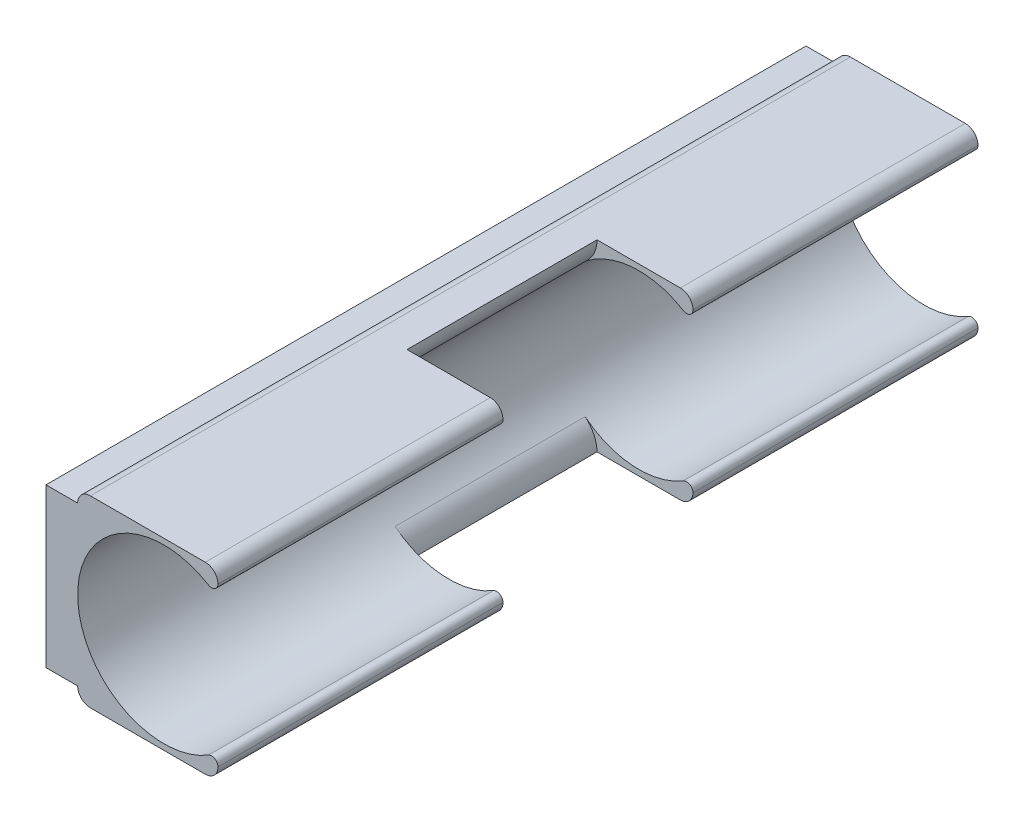
ISO-10303-21;
HEADER;
FILE_DESCRIPTION(('STEP AP214'),'2;1');
FILE_NAME('part.step','',(''),(''),'','','');
FILE_SCHEMA(('AUTOMOTIVE_DESIGN { 1 0 10303 214 1 1 1 1 }'));
ENDSEC;
DATA;
#1=APPLICATION_CONTEXT('core data for automotive mechanical design processes');
#2=APPLICATION_PROTOCOL_DEFINITION('international standard','automotive_design',2000,#1);
#3=PRODUCT_CONTEXT('',#1,'mechanical');
#4=PRODUCT('Part','Part','',(#3));
#5=PRODUCT_RELATED_PRODUCT_CATEGORY('part','',(#4));
#6=PRODUCT_DEFINITION_FORMATION('','',#4);
#7=PRODUCT_DEFINITION_CONTEXT('part definition',#1,'design');
#8=PRODUCT_DEFINITION('design','',#6,#7);
#9=PRODUCT_DEFINITION_SHAPE('','',#8);
#10=(LENGTH_UNIT() NAMED_UNIT(*) SI_UNIT(.MILLI.,.METRE.));
#11=(NAMED_UNIT(*) PLANE_ANGLE_UNIT() SI_UNIT($,.RADIAN.));
#12=(NAMED_UNIT(*) SI_UNIT($,.STERADIAN.) SOLID_ANGLE_UNIT());
#13=UNCERTAINTY_MEASURE_WITH_UNIT(LENGTH_MEASURE(1.E-05),#10,'distance_accuracy_value','');
#14=(GEOMETRIC_REPRESENTATION_CONTEXT(3) GLOBAL_UNCERTAINTY_ASSIGNED_CONTEXT((#13)) GLOBAL_UNIT_ASSIGNED_CONTEXT((#10,
#11,#12)) REPRESENTATION_CONTEXT('',''));
#15=CARTESIAN_POINT('',(0.,0.,0.));
#16=DIRECTION('',(0.,0.,1.));
#17=DIRECTION('',(1.,0.,0.));
#18=AXIS2_PLACEMENT_3D('',#15,#16,#17);
#19=CARTESIAN_POINT('',(0.,27.,-146.474827102845));
#20=DIRECTION('',(0.,-1.,0.));
#21=DIRECTION('',(0.,0.,-1.));
#22=AXIS2_PLACEMENT_3D('',#19,#20,#21);
#23=PLANE('',#22);
#24=DIRECTION('',(1.,0.,0.));
#25=VECTOR('',#24,1.);
#26=CARTESIAN_POINT('',(27.1509925313866,27.,-45.));
#27=LINE('',#26,#25);
#28=CARTESIAN_POINT('',(12.,27.,-45.));
#29=VERTEX_POINT('',#28);
#30=CARTESIAN_POINT('',(25.1509925313866,27.,-45.));
#31=VERTEX_POINT('',#30);
#32=EDGE_CURVE('E232',#29,#31,#27,.T.);
#33=ORIENTED_EDGE('',*,*,#32,.F.);
#34=DIRECTION('',(0.,0.,-1.));
#35=VECTOR('',#34,1.);
#36=CARTESIAN_POINT('',(12.,27.,-45.));
#37=LINE('',#36,#35);
#38=CARTESIAN_POINT('',(12.,27.,-75.));
#39=VERTEX_POINT('',#38);
#40=EDGE_CURVE('E243',#29,#39,#37,.T.);
#41=ORIENTED_EDGE('',*,*,#40,.T.);
#42=DIRECTION('',(1.,0.,0.));
#43=VECTOR('',#42,1.);
#44=CARTESIAN_POINT('',(27.1509925313866,27.,-75.));
#45=LINE('',#44,#43);
#46=CARTESIAN_POINT('',(25.1509925313866,27.,-75.));
#47=VERTEX_POINT('',#46);
#48=EDGE_CURVE('E474',#39,#47,#45,.T.);
#49=ORIENTED_EDGE('',*,*,#48,.T.);
#50=DIRECTION('',(0.,0.,1.));
#51=VECTOR('',#50,1.);
#52=CARTESIAN_POINT('',(25.1509925313866,27.,-146.474827102845));
#53=LINE('',#52,#51);
#54=CARTESIAN_POINT('',(25.1509925313866,27.,-120.));
#55=VERTEX_POINT('',#54);
#56=EDGE_CURVE('E342',#55,#47,#53,.T.);
#57=ORIENTED_EDGE('',*,*,#56,.F.);
#58=DIRECTION('',(-1.,0.,0.));
#59=VECTOR('',#58,1.);
#60=CARTESIAN_POINT('',(0.,27.,-120.));
#61=LINE('',#60,#59);
#62=CARTESIAN_POINT('',(7.,27.,-120.));
#63=VERTEX_POINT('',#62);
#64=EDGE_CURVE('E336',#55,#63,#61,.T.);
#65=ORIENTED_EDGE('',*,*,#64,.T.);
#66=DIRECTION('',(0.,0.,1.));
#67=VECTOR('',#66,1.);
#68=CARTESIAN_POINT('',(7.,27.,-146.474827102845));
#69=LINE('',#68,#67);
#70=CARTESIAN_POINT('',(7.,27.,0.));
#71=VERTEX_POINT('',#70);
#72=EDGE_CURVE('E346',#63,#71,#69,.T.);
#73=ORIENTED_EDGE('',*,*,#72,.T.);
#74=DIRECTION('',(1.,0.,0.));
#75=VECTOR('',#74,1.);
#76=CARTESIAN_POINT('',(0.,27.,0.));
#77=LINE('',#76,#75);
#78=CARTESIAN_POINT('',(25.1509925313866,27.,0.));
#79=VERTEX_POINT('',#78);
#80=EDGE_CURVE('E366',#71,#79,#77,.T.);
#81=ORIENTED_EDGE('',*,*,#80,.T.);
#82=EDGE_CURVE('E347',#31,#79,#53,.T.);
#83=ORIENTED_EDGE('',*,*,#82,.F.);
#84=EDGE_LOOP('',(#33,#41,#49,#57,#65,#73,#81,#83));
#85=FACE_BOUND('',#84,.T.);
#86=ADVANCED_FACE('F47',(#85),#23,.F.);
#87=CARTESIAN_POINT('',(18.6,12.5,-146.474827102845));
#88=DIRECTION('',(0.,0.,1.));
#89=DIRECTION('',(1.,0.,0.));
#90=AXIS2_PLACEMENT_3D('',#87,#88,#89);
#91=CYLINDRICAL_SURFACE('',#90,13.6);
#92=DIRECTION('',(0.,0.,1.));
#93=VECTOR('',#92,1.);
#94=CARTESIAN_POINT('',(10.1183949695681,1.86880175578724,-146.474827102845));
#95=LINE('',#94,#93);
#96=CARTESIAN_POINT('',(10.1183949695681,1.86880175578724,-45.));
#97=VERTEX_POINT('',#96);
#98=CARTESIAN_POINT('',(10.1183949695681,1.86880175578724,-75.));
#99=VERTEX_POINT('',#98);
#100=EDGE_CURVE('E246',#97,#99,#95,.F.);
#101=ORIENTED_EDGE('',*,*,#100,.T.);
#102=CARTESIAN_POINT('',(18.6,12.5,-75.));
#103=DIRECTION('',(0.,0.,-1.));
#104=DIRECTION('',(-1.,0.,0.));
#105=AXIS2_PLACEMENT_3D('',#102,#103,#104);
#106=CIRCLE('',#105,13.6);
#107=CARTESIAN_POINT('',(25.6338012621136,0.860170112708289,-75.));
#108=VERTEX_POINT('',#107);
#109=EDGE_CURVE('E63',#99,#108,#106,.F.);
#110=ORIENTED_EDGE('',*,*,#109,.T.);
#111=DIRECTION('',(0.,0.,1.));
#112=VECTOR('',#111,1.);
#113=CARTESIAN_POINT('',(25.6338012621136,0.860170112708286,-146.474827102845));
#114=LINE('',#113,#112);
#115=CARTESIAN_POINT('',(25.6338012621136,0.860170112708289,-120.));
#116=VERTEX_POINT('',#115);
#117=EDGE_CURVE('E281',#108,#116,#114,.F.);
#118=ORIENTED_EDGE('',*,*,#117,.T.);
#119=CARTESIAN_POINT('',(18.6,12.5,-120.));
#120=DIRECTION('',(0.,0.,1.));
#121=DIRECTION('',(1.,0.,0.));
#122=AXIS2_PLACEMENT_3D('',#119,#120,#121);
#123=CIRCLE('',#122,13.6);
#124=CARTESIAN_POINT('',(25.6338012621136,24.1398298872917,-120.));
#125=VERTEX_POINT('',#124);
#126=EDGE_CURVE('E382',#116,#125,#123,.F.);
#127=ORIENTED_EDGE('',*,*,#126,.T.);
#128=DIRECTION('',(0.,0.,1.));
#129=VECTOR('',#128,1.);
#130=CARTESIAN_POINT('',(25.6338012621136,24.1398298872917,-146.474827102845));
#131=LINE('',#130,#129);
#132=CARTESIAN_POINT('',(25.6338012621136,24.1398298872917,-75.));
#133=VERTEX_POINT('',#132);
#134=EDGE_CURVE('E282',#125,#133,#131,.T.);
#135=ORIENTED_EDGE('',*,*,#134,.T.);
#136=CARTESIAN_POINT('',(10.1183949695681,23.1311982442128,-75.));
#137=VERTEX_POINT('',#136);
#138=EDGE_CURVE('E468',#133,#137,#106,.F.);
#139=ORIENTED_EDGE('',*,*,#138,.T.);
#140=DIRECTION('',(0.,0.,1.));
#141=VECTOR('',#140,1.);
#142=CARTESIAN_POINT('',(10.1183949695681,23.1311982442128,-146.474827102845));
#143=LINE('',#142,#141);
#144=CARTESIAN_POINT('',(10.1183949695681,23.1311982442128,-45.));
#145=VERTEX_POINT('',#144);
#146=EDGE_CURVE('E256',#137,#145,#143,.T.);
#147=ORIENTED_EDGE('',*,*,#146,.T.);
#148=CARTESIAN_POINT('',(18.6,12.5,-45.));
#149=DIRECTION('',(0.,0.,-1.));
#150=DIRECTION('',(-1.,0.,0.));
#151=AXIS2_PLACEMENT_3D('',#148,#149,#150);
#152=CIRCLE('',#151,13.6);
#153=CARTESIAN_POINT('',(25.6338012621136,24.1398298872917,-45.));
#154=VERTEX_POINT('',#153);
#155=EDGE_CURVE('E455',#154,#145,#152,.F.);
#156=ORIENTED_EDGE('',*,*,#155,.F.);
#157=CARTESIAN_POINT('',(25.6338012621136,24.1398298872917,0.));
#158=VERTEX_POINT('',#157);
#159=EDGE_CURVE('E286',#154,#158,#131,.T.);
#160=ORIENTED_EDGE('',*,*,#159,.T.);
#161=CARTESIAN_POINT('',(18.6,12.5,0.));
#162=DIRECTION('',(0.,0.,1.));
#163=DIRECTION('',(1.,0.,0.));
#164=AXIS2_PLACEMENT_3D('',#161,#162,#163);
#165=CIRCLE('',#164,13.6);
#166=CARTESIAN_POINT('',(25.6338012621136,0.860170112708289,0.));
#167=VERTEX_POINT('',#166);
#168=EDGE_CURVE('E358',#158,#167,#165,.T.);
#169=ORIENTED_EDGE('',*,*,#168,.T.);
#170=CARTESIAN_POINT('',(25.6338012621136,0.860170112708289,-45.));
#171=VERTEX_POINT('',#170);
#172=EDGE_CURVE('E278',#167,#171,#114,.F.);
#173=ORIENTED_EDGE('',*,*,#172,.T.);
#174=EDGE_CURVE('E71',#97,#171,#152,.F.);
#175=ORIENTED_EDGE('',*,*,#174,.F.);
#176=EDGE_LOOP('',(#101,#110,#118,#127,#135,#139,#147,#156,#160,#169,#173,#175));
#177=FACE_BOUND('',#176,.T.);
#178=ADVANCED_FACE('F554',(#177),#91,.F.);
#179=CARTESIAN_POINT('',(27.1509925313867,0.,-146.474827102845));
#180=DIRECTION('',(1.,0.,0.));
#181=DIRECTION('',(0.,1.,0.));
#182=AXIS2_PLACEMENT_3D('',#179,#180,#181);
#183=PLANE('',#182);
#184=DIRECTION('',(0.,0.,-1.));
#185=VECTOR('',#184,1.);
#186=CARTESIAN_POINT('',(27.1509925313866,24.9956997319455,-120.));
#187=LINE('',#186,#185);
#188=CARTESIAN_POINT('',(27.1509925313866,24.9956997319455,0.));
#189=VERTEX_POINT('',#188);
#190=CARTESIAN_POINT('',(27.1509925313866,24.9956997319455,-45.));
#191=VERTEX_POINT('',#190);
#192=EDGE_CURVE('E267',#189,#191,#187,.T.);
#193=ORIENTED_EDGE('',*,*,#192,.T.);
#194=DIRECTION('',(0.,-1.,0.));
#195=VECTOR('',#194,1.);
#196=CARTESIAN_POINT('',(27.1509925313866,27.,-45.));
#197=LINE('',#196,#195);
#198=CARTESIAN_POINT('',(27.1509925313866,25.,-45.));
#199=VERTEX_POINT('',#198);
#200=EDGE_CURVE('E233',#199,#191,#197,.T.);
#201=ORIENTED_EDGE('',*,*,#200,.F.);
#202=DIRECTION('',(0.,0.,1.));
#203=VECTOR('',#202,1.);
#204=CARTESIAN_POINT('',(27.1509925313866,25.,-146.474827102845));
#205=LINE('',#204,#203);
#206=CARTESIAN_POINT('',(27.1509925313866,25.,0.));
#207=VERTEX_POINT('',#206);
#208=EDGE_CURVE('E350',#199,#207,#205,.T.);
#209=ORIENTED_EDGE('',*,*,#208,.T.);
#210=DIRECTION('',(0.,1.,0.));
#211=VECTOR('',#210,1.);
#212=CARTESIAN_POINT('',(27.1509925313867,0.,0.));
#213=LINE('',#212,#211);
#214=EDGE_CURVE('E354',#189,#207,#213,.T.);
#215=ORIENTED_EDGE('',*,*,#214,.F.);
#216=EDGE_LOOP('',(#193,#201,#209,#215));
#217=FACE_BOUND('',#216,.T.);
#218=ADVANCED_FACE('F504',(#217),#183,.T.);
#219=CARTESIAN_POINT('',(25.1509925313866,25.,-146.474827102845));
#220=DIRECTION('',(0.,0.,1.));
#221=DIRECTION('',(1.,0.,0.));
#222=AXIS2_PLACEMENT_3D('',#219,#220,#221);
#223=CYLINDRICAL_SURFACE('',#222,2.);
#224=CARTESIAN_POINT('',(25.1509925313866,25.,-45.));
#225=DIRECTION('',(0.,0.,-1.));
#226=DIRECTION('',(-1.,0.,0.));
#227=AXIS2_PLACEMENT_3D('',#224,#225,#226);
#228=CIRCLE('',#227,2.);
#229=EDGE_CURVE('E435',#31,#199,#228,.T.);
#230=ORIENTED_EDGE('',*,*,#229,.F.);
#231=ORIENTED_EDGE('',*,*,#82,.T.);
#232=CARTESIAN_POINT('',(25.1509925313866,25.,0.));
#233=DIRECTION('',(0.,0.,1.));
#234=DIRECTION('',(1.,0.,0.));
#235=AXIS2_PLACEMENT_3D('',#232,#233,#234);
#236=CIRCLE('',#235,2.);
#237=EDGE_CURVE('E370',#79,#207,#236,.F.);
#238=ORIENTED_EDGE('',*,*,#237,.T.);
#239=ORIENTED_EDGE('',*,*,#208,.F.);
#240=EDGE_LOOP('',(#230,#231,#238,#239));
#241=FACE_BOUND('',#240,.T.);
#242=ADVANCED_FACE('F512',(#241),#223,.T.);
#243=CARTESIAN_POINT('',(0.,-2.00000000000001,-146.474827102845));
#244=DIRECTION('',(0.,-1.,0.));
#245=DIRECTION('',(0.,0.,-1.));
#246=AXIS2_PLACEMENT_3D('',#243,#244,#245);
#247=PLANE('',#246);
#248=DIRECTION('',(0.,0.,-1.));
#249=VECTOR('',#248,1.);
#250=CARTESIAN_POINT('',(12.,-2.00000000000001,-45.));
#251=LINE('',#250,#249);
#252=CARTESIAN_POINT('',(12.,-2.00000000000001,-45.));
#253=VERTEX_POINT('',#252);
#254=CARTESIAN_POINT('',(12.,-2.00000000000001,-75.));
#255=VERTEX_POINT('',#254);
#256=EDGE_CURVE('E237',#253,#255,#251,.T.);
#257=ORIENTED_EDGE('',*,*,#256,.F.);
#258=DIRECTION('',(-1.,0.,0.));
#259=VECTOR('',#258,1.);
#260=CARTESIAN_POINT('',(27.1509925313866,-2.00000000000001,-45.));
#261=LINE('',#260,#259);
#262=CARTESIAN_POINT('',(25.1509925313866,-2.,-45.));
#263=VERTEX_POINT('',#262);
#264=EDGE_CURVE('E221',#263,#253,#261,.T.);
#265=ORIENTED_EDGE('',*,*,#264,.F.);
#266=DIRECTION('',(0.,0.,1.));
#267=VECTOR('',#266,1.);
#268=CARTESIAN_POINT('',(25.1509925313866,-2.00000000000001,-146.474827102845));
#269=LINE('',#268,#267);
#270=CARTESIAN_POINT('',(25.1509925313866,-2.00000000000001,0.));
#271=VERTEX_POINT('',#270);
#272=EDGE_CURVE('E427',#263,#271,#269,.T.);
#273=ORIENTED_EDGE('',*,*,#272,.T.);
#274=DIRECTION('',(1.,0.,0.));
#275=VECTOR('',#274,1.);
#276=CARTESIAN_POINT('',(0.,-2.00000000000001,0.));
#277=LINE('',#276,#275);
#278=CARTESIAN_POINT('',(7.,-2.00000000000001,0.));
#279=VERTEX_POINT('',#278);
#280=EDGE_CURVE('E403',#279,#271,#277,.T.);
#281=ORIENTED_EDGE('',*,*,#280,.F.);
#282=DIRECTION('',(0.,0.,1.));
#283=VECTOR('',#282,1.);
#284=CARTESIAN_POINT('',(7.,-2.00000000000001,-146.474827102845));
#285=LINE('',#284,#283);
#286=CARTESIAN_POINT('',(7.,-2.,-120.));
#287=VERTEX_POINT('',#286);
#288=EDGE_CURVE('E394',#287,#279,#285,.T.);
#289=ORIENTED_EDGE('',*,*,#288,.F.);
#290=DIRECTION('',(-1.,0.,0.));
#291=VECTOR('',#290,1.);
#292=CARTESIAN_POINT('',(0.,-2.00000000000001,-120.));
#293=LINE('',#292,#291);
#294=CARTESIAN_POINT('',(25.1509925313866,-2.00000000000001,-120.));
#295=VERTEX_POINT('',#294);
#296=EDGE_CURVE('E399',#295,#287,#293,.T.);
#297=ORIENTED_EDGE('',*,*,#296,.F.);
#298=CARTESIAN_POINT('',(25.1509925313866,-2.,-75.));
#299=VERTEX_POINT('',#298);
#300=EDGE_CURVE('E421',#295,#299,#269,.T.);
#301=ORIENTED_EDGE('',*,*,#300,.T.);
#302=DIRECTION('',(-1.,0.,0.));
#303=VECTOR('',#302,1.);
#304=CARTESIAN_POINT('',(27.1509925313866,-2.00000000000001,-75.));
#305=LINE('',#304,#303);
#306=EDGE_CURVE('E240',#299,#255,#305,.T.);
#307=ORIENTED_EDGE('',*,*,#306,.T.);
#308=EDGE_LOOP('',(#257,#265,#273,#281,#289,#297,#301,#307));
#309=FACE_BOUND('',#308,.T.);
#310=ADVANCED_FACE('F238',(#309),#247,.T.);
#311=CARTESIAN_POINT('',(27.1509925313866,0.,-146.474827102845));
#312=DIRECTION('',(-1.,0.,0.));
#313=DIRECTION('',(0.,-1.,0.));
#314=AXIS2_PLACEMENT_3D('',#311,#312,#313);
#315=PLANE('',#314);
#316=CARTESIAN_POINT('',(27.1509925313866,0.00430026805448522,-45.));
#317=VERTEX_POINT('',#316);
#318=CARTESIAN_POINT('',(27.1509925313866,0.,-45.));
#319=VERTEX_POINT('',#318);
#320=EDGE_CURVE('E478',#317,#319,#197,.T.);
#321=ORIENTED_EDGE('',*,*,#320,.F.);
#322=DIRECTION('',(0.,0.,1.));
#323=VECTOR('',#322,1.);
#324=CARTESIAN_POINT('',(27.1509925313866,0.00430026805448354,-146.474827102845));
#325=LINE('',#324,#323);
#326=CARTESIAN_POINT('',(27.1509925313866,0.00430026805448354,0.));
#327=VERTEX_POINT('',#326);
#328=EDGE_CURVE('E297',#317,#327,#325,.T.);
#329=ORIENTED_EDGE('',*,*,#328,.T.);
#330=DIRECTION('',(0.,-1.,0.));
#331=VECTOR('',#330,1.);
#332=CARTESIAN_POINT('',(27.1509925313866,0.,0.));
#333=LINE('',#332,#331);
#334=CARTESIAN_POINT('',(27.1509925313866,0.,0.));
#335=VERTEX_POINT('',#334);
#336=EDGE_CURVE('E393',#327,#335,#333,.T.);
#337=ORIENTED_EDGE('',*,*,#336,.T.);
#338=DIRECTION('',(0.,0.,1.));
#339=VECTOR('',#338,1.);
#340=CARTESIAN_POINT('',(27.1509925313866,0.,-146.474827102845));
#341=LINE('',#340,#339);
#342=EDGE_CURVE('E415',#319,#335,#341,.T.);
#343=ORIENTED_EDGE('',*,*,#342,.F.);
#344=EDGE_LOOP('',(#321,#329,#337,#343));
#345=FACE_BOUND('',#344,.T.);
#346=ADVANCED_FACE('F547',(#345),#315,.F.);
#347=CARTESIAN_POINT('',(25.1509925313866,0.,-146.474827102845));
#348=DIRECTION('',(0.,0.,1.));
#349=DIRECTION('',(1.,0.,0.));
#350=AXIS2_PLACEMENT_3D('',#347,#348,#349);
#351=CYLINDRICAL_SURFACE('',#350,2.);
#352=ORIENTED_EDGE('',*,*,#272,.F.);
#353=CARTESIAN_POINT('',(25.1509925313866,0.,-45.));
#354=DIRECTION('',(0.,0.,-1.));
#355=DIRECTION('',(-1.,0.,0.));
#356=AXIS2_PLACEMENT_3D('',#353,#354,#355);
#357=CIRCLE('',#356,2.);
#358=EDGE_CURVE('E228',#263,#319,#357,.F.);
#359=ORIENTED_EDGE('',*,*,#358,.T.);
#360=ORIENTED_EDGE('',*,*,#342,.T.);
#361=CARTESIAN_POINT('',(25.1509925313866,0.,0.));
#362=DIRECTION('',(0.,0.,1.));
#363=DIRECTION('',(1.,0.,0.));
#364=AXIS2_PLACEMENT_3D('',#361,#362,#363);
#365=CIRCLE('',#364,2.);
#366=EDGE_CURVE('E407',#271,#335,#365,.T.);
#367=ORIENTED_EDGE('',*,*,#366,.F.);
#368=EDGE_LOOP('',(#352,#359,#360,#367));
#369=FACE_BOUND('',#368,.T.);
#370=ADVANCED_FACE('F543',(#369),#351,.T.);
#371=CARTESIAN_POINT('',(26.1509925313866,0.00430026805448534,-146.474827102845));
#372=DIRECTION('',(0.,0.,1.));
#373=DIRECTION('',(1.,0.,0.));
#374=AXIS2_PLACEMENT_3D('',#371,#372,#373);
#375=CYLINDRICAL_SURFACE('',#374,1.);
#376=ORIENTED_EDGE('',*,*,#328,.F.);
#377=CARTESIAN_POINT('',(26.1509925313866,0.00430026805448534,-45.));
#378=DIRECTION('',(0.,0.,-1.));
#379=DIRECTION('',(-1.,0.,0.));
#380=AXIS2_PLACEMENT_3D('',#377,#378,#379);
#381=CIRCLE('',#380,1.);
#382=EDGE_CURVE('E451',#317,#171,#381,.F.);
#383=ORIENTED_EDGE('',*,*,#382,.T.);
#384=ORIENTED_EDGE('',*,*,#172,.F.);
#385=CARTESIAN_POINT('',(26.1509925313866,0.00430026805448534,0.));
#386=DIRECTION('',(0.,0.,-1.));
#387=DIRECTION('',(-1.,0.,0.));
#388=AXIS2_PLACEMENT_3D('',#385,#386,#387);
#389=CIRCLE('',#388,1.);
#390=EDGE_CURVE('E287',#327,#167,#389,.F.);
#391=ORIENTED_EDGE('',*,*,#390,.F.);
#392=EDGE_LOOP('',(#376,#383,#384,#391));
#393=FACE_BOUND('',#392,.T.);
#394=ADVANCED_FACE('F553',(#393),#375,.T.);
#395=CARTESIAN_POINT('',(26.1509925313866,24.9956997319455,-146.474827102845));
#396=DIRECTION('',(0.,0.,1.));
#397=DIRECTION('',(1.,0.,0.));
#398=AXIS2_PLACEMENT_3D('',#395,#396,#397);
#399=CYLINDRICAL_SURFACE('',#398,1.);
#400=ORIENTED_EDGE('',*,*,#159,.F.);
#401=CARTESIAN_POINT('',(26.1509925313866,24.9956997319455,-45.));
#402=DIRECTION('',(0.,0.,-1.));
#403=DIRECTION('',(-1.,0.,0.));
#404=AXIS2_PLACEMENT_3D('',#401,#402,#403);
#405=CIRCLE('',#404,1.);
#406=EDGE_CURVE('E260',#154,#191,#405,.F.);
#407=ORIENTED_EDGE('',*,*,#406,.T.);
#408=ORIENTED_EDGE('',*,*,#192,.F.);
#409=CARTESIAN_POINT('',(26.1509925313866,24.9956997319455,0.));
#410=DIRECTION('',(0.,0.,-1.));
#411=DIRECTION('',(-1.,0.,0.));
#412=AXIS2_PLACEMENT_3D('',#409,#410,#411);
#413=CIRCLE('',#412,1.);
#414=EDGE_CURVE('E290',#158,#189,#413,.F.);
#415=ORIENTED_EDGE('',*,*,#414,.F.);
#416=EDGE_LOOP('',(#400,#407,#408,#415));
#417=FACE_BOUND('',#416,.T.);
#418=ADVANCED_FACE('F501',(#417),#399,.T.);
#419=CARTESIAN_POINT('',(5.,0.,0.));
#420=DIRECTION('',(0.,0.,-1.));
#421=DIRECTION('',(-1.,0.,0.));
#422=AXIS2_PLACEMENT_3D('',#419,#420,#421);
#423=PLANE('',#422);
#424=ORIENTED_EDGE('',*,*,#336,.F.);
#425=ORIENTED_EDGE('',*,*,#390,.T.);
#426=ORIENTED_EDGE('',*,*,#168,.F.);
#427=ORIENTED_EDGE('',*,*,#414,.T.);
#428=ORIENTED_EDGE('',*,*,#214,.T.);
#429=ORIENTED_EDGE('',*,*,#237,.F.);
#430=ORIENTED_EDGE('',*,*,#80,.F.);
#431=CARTESIAN_POINT('',(7.,25.,0.));
#432=DIRECTION('',(0.,0.,1.));
#433=DIRECTION('',(1.,0.,0.));
#434=AXIS2_PLACEMENT_3D('',#431,#432,#433);
#435=CIRCLE('',#434,2.);
#436=CARTESIAN_POINT('',(5.,25.,0.));
#437=VERTEX_POINT('',#436);
#438=EDGE_CURVE('E362',#437,#71,#435,.F.);
#439=ORIENTED_EDGE('',*,*,#438,.F.);
#440=DIRECTION('',(-1.,0.,0.));
#441=VECTOR('',#440,1.);
#442=CARTESIAN_POINT('',(5.,25.,0.));
#443=LINE('',#442,#441);
#444=CARTESIAN_POINT('',(0.,25.,0.));
#445=VERTEX_POINT('',#444);
#446=EDGE_CURVE('E310',#437,#445,#443,.T.);
#447=ORIENTED_EDGE('',*,*,#446,.T.);
#448=DIRECTION('',(0.,-1.,0.));
#449=VECTOR('',#448,1.);
#450=CARTESIAN_POINT('',(0.,0.,0.));
#451=LINE('',#450,#449);
#452=CARTESIAN_POINT('',(0.,0.,0.));
#453=VERTEX_POINT('',#452);
#454=EDGE_CURVE('E325',#445,#453,#451,.T.);
#455=ORIENTED_EDGE('',*,*,#454,.T.);
#456=DIRECTION('',(-1.,0.,0.));
#457=VECTOR('',#456,1.);
#458=CARTESIAN_POINT('',(5.,0.,0.));
#459=LINE('',#458,#457);
#460=CARTESIAN_POINT('',(5.,0.,0.));
#461=VERTEX_POINT('',#460);
#462=EDGE_CURVE('E298',#461,#453,#459,.T.);
#463=ORIENTED_EDGE('',*,*,#462,.F.);
#464=CARTESIAN_POINT('',(7.,0.,0.));
#465=DIRECTION('',(0.,0.,1.));
#466=DIRECTION('',(1.,0.,0.));
#467=AXIS2_PLACEMENT_3D('',#464,#465,#466);
#468=CIRCLE('',#467,2.);
#469=EDGE_CURVE('E402',#461,#279,#468,.T.);
#470=ORIENTED_EDGE('',*,*,#469,.T.);
#471=ORIENTED_EDGE('',*,*,#280,.T.);
#472=ORIENTED_EDGE('',*,*,#366,.T.);
#473=EDGE_LOOP('',(#424,#425,#426,#427,#428,#429,#430,#439,#447,#455,#463,#470,#471,#472));
#474=FACE_BOUND('',#473,.T.);
#475=ADVANCED_FACE('F508',(#474),#423,.F.);
#476=CARTESIAN_POINT('',(5.,0.,0.));
#477=DIRECTION('',(0.,1.,0.));
#478=DIRECTION('',(0.,0.,1.));
#479=AXIS2_PLACEMENT_3D('',#476,#477,#478);
#480=PLANE('',#479);
#481=DIRECTION('',(0.,0.,-1.));
#482=VECTOR('',#481,1.);
#483=CARTESIAN_POINT('',(0.,0.,0.));
#484=LINE('',#483,#482);
#485=CARTESIAN_POINT('',(0.,0.,-120.));
#486=VERTEX_POINT('',#485);
#487=EDGE_CURVE('E322',#453,#486,#484,.T.);
#488=ORIENTED_EDGE('',*,*,#487,.T.);
#489=DIRECTION('',(-1.,0.,0.));
#490=VECTOR('',#489,1.);
#491=CARTESIAN_POINT('',(5.,0.,-120.));
#492=LINE('',#491,#490);
#493=CARTESIAN_POINT('',(5.,0.,-120.));
#494=VERTEX_POINT('',#493);
#495=EDGE_CURVE('E302',#494,#486,#492,.T.);
#496=ORIENTED_EDGE('',*,*,#495,.F.);
#497=DIRECTION('',(0.,0.,-1.));
#498=VECTOR('',#497,1.);
#499=CARTESIAN_POINT('',(5.,0.,0.));
#500=LINE('',#499,#498);
#501=EDGE_CURVE('E318',#461,#494,#500,.T.);
#502=ORIENTED_EDGE('',*,*,#501,.F.);
#503=ORIENTED_EDGE('',*,*,#462,.T.);
#504=EDGE_LOOP('',(#488,#496,#502,#503));
#505=FACE_BOUND('',#504,.T.);
#506=ADVANCED_FACE('F619',(#505),#480,.F.);
#507=CARTESIAN_POINT('',(5.,0.,-120.));
#508=DIRECTION('',(0.,0.,1.));
#509=DIRECTION('',(1.,0.,0.));
#510=AXIS2_PLACEMENT_3D('',#507,#508,#509);
#511=PLANE('',#510);
#512=ORIENTED_EDGE('',*,*,#126,.F.);
#513=CARTESIAN_POINT('',(26.1509925313866,0.00430026805448534,-120.));
#514=DIRECTION('',(0.,0.,1.));
#515=DIRECTION('',(1.,0.,0.));
#516=AXIS2_PLACEMENT_3D('',#513,#514,#515);
#517=CIRCLE('',#516,1.);
#518=CARTESIAN_POINT('',(27.1509925313866,0.00430026805448354,-120.));
#519=VERTEX_POINT('',#518);
#520=EDGE_CURVE('E272',#116,#519,#517,.F.);
#521=ORIENTED_EDGE('',*,*,#520,.T.);
#522=DIRECTION('',(0.,1.,0.));
#523=VECTOR('',#522,1.);
#524=CARTESIAN_POINT('',(27.1509925313866,0.,-120.));
#525=LINE('',#524,#523);
#526=CARTESIAN_POINT('',(27.1509925313866,0.,-120.));
#527=VERTEX_POINT('',#526);
#528=EDGE_CURVE('E389',#527,#519,#525,.T.);
#529=ORIENTED_EDGE('',*,*,#528,.F.);
#530=CARTESIAN_POINT('',(25.1509925313866,0.,-120.));
#531=DIRECTION('',(0.,0.,1.));
#532=DIRECTION('',(1.,0.,0.));
#533=AXIS2_PLACEMENT_3D('',#530,#531,#532);
#534=CIRCLE('',#533,2.);
#535=EDGE_CURVE('E374',#527,#295,#534,.F.);
#536=ORIENTED_EDGE('',*,*,#535,.T.);
#537=ORIENTED_EDGE('',*,*,#296,.T.);
#538=CARTESIAN_POINT('',(7.,0.,-120.));
#539=DIRECTION('',(0.,0.,1.));
#540=DIRECTION('',(1.,0.,0.));
#541=AXIS2_PLACEMENT_3D('',#538,#539,#540);
#542=CIRCLE('',#541,2.);
#543=EDGE_CURVE('E395',#287,#494,#542,.F.);
#544=ORIENTED_EDGE('',*,*,#543,.T.);
#545=ORIENTED_EDGE('',*,*,#495,.T.);
#546=DIRECTION('',(0.,1.,0.));
#547=VECTOR('',#546,1.);
#548=CARTESIAN_POINT('',(0.,0.,-120.));
#549=LINE('',#548,#547);
#550=CARTESIAN_POINT('',(0.,25.,-120.));
#551=VERTEX_POINT('',#550);
#552=EDGE_CURVE('E319',#486,#551,#549,.T.);
#553=ORIENTED_EDGE('',*,*,#552,.T.);
#554=DIRECTION('',(-1.,0.,0.));
#555=VECTOR('',#554,1.);
#556=CARTESIAN_POINT('',(5.,25.,-120.));
#557=LINE('',#556,#555);
#558=CARTESIAN_POINT('',(5.,25.,-120.));
#559=VERTEX_POINT('',#558);
#560=EDGE_CURVE('E306',#559,#551,#557,.T.);
#561=ORIENTED_EDGE('',*,*,#560,.F.);
#562=CARTESIAN_POINT('',(7.,25.,-120.));
#563=DIRECTION('',(0.,0.,1.));
#564=DIRECTION('',(1.,0.,0.));
#565=AXIS2_PLACEMENT_3D('',#562,#563,#564);
#566=CIRCLE('',#565,2.);
#567=EDGE_CURVE('E340',#63,#559,#566,.T.);
#568=ORIENTED_EDGE('',*,*,#567,.F.);
#569=ORIENTED_EDGE('',*,*,#64,.F.);
#570=CARTESIAN_POINT('',(25.1509925313866,25.,-120.));
#571=DIRECTION('',(0.,0.,1.));
#572=DIRECTION('',(1.,0.,0.));
#573=AXIS2_PLACEMENT_3D('',#570,#571,#572);
#574=CIRCLE('',#573,2.);
#575=CARTESIAN_POINT('',(27.1509925313866,25.,-120.));
#576=VERTEX_POINT('',#575);
#577=EDGE_CURVE('E329',#576,#55,#574,.T.);
#578=ORIENTED_EDGE('',*,*,#577,.F.);
#579=DIRECTION('',(0.,-1.,0.));
#580=VECTOR('',#579,1.);
#581=CARTESIAN_POINT('',(27.1509925313867,0.,-120.));
#582=LINE('',#581,#580);
#583=CARTESIAN_POINT('',(27.1509925313866,24.9956997319455,-120.));
#584=VERTEX_POINT('',#583);
#585=EDGE_CURVE('E378',#576,#584,#582,.T.);
#586=ORIENTED_EDGE('',*,*,#585,.T.);
#587=CARTESIAN_POINT('',(26.1509925313866,24.9956997319455,-120.));
#588=DIRECTION('',(0.,0.,1.));
#589=DIRECTION('',(1.,0.,0.));
#590=AXIS2_PLACEMENT_3D('',#587,#588,#589);
#591=CIRCLE('',#590,1.);
#592=EDGE_CURVE('E275',#584,#125,#591,.F.);
#593=ORIENTED_EDGE('',*,*,#592,.T.);
#594=EDGE_LOOP('',(#512,#521,#529,#536,#537,#544,#545,#553,#561,#568,#569,#578,#586,#593));
#595=FACE_BOUND('',#594,.T.);
#596=ADVANCED_FACE('F528',(#595),#511,.F.);
#597=CARTESIAN_POINT('',(5.,25.,0.));
#598=DIRECTION('',(0.,-1.,0.));
#599=DIRECTION('',(0.,0.,-1.));
#600=AXIS2_PLACEMENT_3D('',#597,#598,#599);
#601=PLANE('',#600);
#602=DIRECTION('',(0.,0.,1.));
#603=VECTOR('',#602,1.);
#604=CARTESIAN_POINT('',(0.,25.,0.));
#605=LINE('',#604,#603);
#606=EDGE_CURVE('E315',#551,#445,#605,.T.);
#607=ORIENTED_EDGE('',*,*,#606,.T.);
#608=ORIENTED_EDGE('',*,*,#446,.F.);
#609=DIRECTION('',(0.,0.,1.));
#610=VECTOR('',#609,1.);
#611=CARTESIAN_POINT('',(5.,25.,0.));
#612=LINE('',#611,#610);
#613=EDGE_CURVE('E314',#559,#437,#612,.T.);
#614=ORIENTED_EDGE('',*,*,#613,.F.);
#615=ORIENTED_EDGE('',*,*,#560,.T.);
#616=EDGE_LOOP('',(#607,#608,#614,#615));
#617=FACE_BOUND('',#616,.T.);
#618=ADVANCED_FACE('F524',(#617),#601,.F.);
#619=CARTESIAN_POINT('',(0.,0.,0.));
#620=DIRECTION('',(-1.,0.,0.));
#621=DIRECTION('',(0.,0.,1.));
#622=AXIS2_PLACEMENT_3D('',#619,#620,#621);
#623=PLANE('',#622);
#624=CARTESIAN_POINT('',(0.,12.5,-100.));
#625=DIRECTION('',(-1.,0.,0.));
#626=DIRECTION('',(0.,0.,1.));
#627=AXIS2_PLACEMENT_3D('',#624,#625,#626);
#628=CIRCLE('',#627,1.5);
#629=CARTESIAN_POINT('',(0.,12.5,-98.5));
#630=VERTEX_POINT('',#629);
#631=EDGE_CURVE('E439',#630,#630,#628,.T.);
#632=ORIENTED_EDGE('',*,*,#631,.F.);
#633=EDGE_LOOP('',(#632));
#634=FACE_BOUND('',#633,.T.);
#635=CARTESIAN_POINT('',(0.,12.5,-20.));
#636=DIRECTION('',(-1.,0.,0.));
#637=DIRECTION('',(0.,0.,-1.));
#638=AXIS2_PLACEMENT_3D('',#635,#636,#637);
#639=CIRCLE('',#638,1.5);
#640=CARTESIAN_POINT('',(0.,12.5,-21.5));
#641=VERTEX_POINT('',#640);
#642=EDGE_CURVE('E434',#641,#641,#639,.T.);
#643=ORIENTED_EDGE('',*,*,#642,.F.);
#644=EDGE_LOOP('',(#643));
#645=FACE_BOUND('',#644,.T.);
#646=ORIENTED_EDGE('',*,*,#454,.F.);
#647=ORIENTED_EDGE('',*,*,#606,.F.);
#648=ORIENTED_EDGE('',*,*,#552,.F.);
#649=ORIENTED_EDGE('',*,*,#487,.F.);
#650=EDGE_LOOP('',(#646,#647,#648,#649));
#651=FACE_BOUND('',#650,.T.);
#652=ADVANCED_FACE('F531',(#634,#645,#651),#623,.T.);
#653=CARTESIAN_POINT('',(7.,25.,-146.474827102845));
#654=DIRECTION('',(0.,0.,1.));
#655=DIRECTION('',(1.,0.,0.));
#656=AXIS2_PLACEMENT_3D('',#653,#654,#655);
#657=CYLINDRICAL_SURFACE('',#656,2.);
#658=ORIENTED_EDGE('',*,*,#72,.F.);
#659=ORIENTED_EDGE('',*,*,#567,.T.);
#660=ORIENTED_EDGE('',*,*,#613,.T.);
#661=ORIENTED_EDGE('',*,*,#438,.T.);
#662=EDGE_LOOP('',(#658,#659,#660,#661));
#663=FACE_BOUND('',#662,.T.);
#664=ADVANCED_FACE('F521',(#663),#657,.T.);
#665=DIRECTION('',(0.,-1.,0.));
#666=VECTOR('',#665,1.);
#667=CARTESIAN_POINT('',(27.1509925313866,27.,-75.));
#668=LINE('',#667,#666);
#669=CARTESIAN_POINT('',(27.1509925313866,25.,-75.));
#670=VERTEX_POINT('',#669);
#671=CARTESIAN_POINT('',(27.1509925313866,24.9956997319455,-75.));
#672=VERTEX_POINT('',#671);
#673=EDGE_CURVE('E481',#670,#672,#668,.T.);
#674=ORIENTED_EDGE('',*,*,#673,.T.);
#675=EDGE_CURVE('E271',#672,#584,#187,.T.);
#676=ORIENTED_EDGE('',*,*,#675,.T.);
#677=ORIENTED_EDGE('',*,*,#585,.F.);
#678=EDGE_CURVE('E341',#576,#670,#205,.T.);
#679=ORIENTED_EDGE('',*,*,#678,.T.);
#680=EDGE_LOOP('',(#674,#676,#677,#679));
#681=FACE_BOUND('',#680,.T.);
#682=ADVANCED_FACE('F572',(#681),#183,.T.);
#683=ORIENTED_EDGE('',*,*,#56,.T.);
#684=CARTESIAN_POINT('',(25.1509925313866,25.,-75.));
#685=DIRECTION('',(0.,0.,-1.));
#686=DIRECTION('',(-1.,0.,0.));
#687=AXIS2_PLACEMENT_3D('',#684,#685,#686);
#688=CIRCLE('',#687,2.);
#689=EDGE_CURVE('E458',#47,#670,#688,.T.);
#690=ORIENTED_EDGE('',*,*,#689,.T.);
#691=ORIENTED_EDGE('',*,*,#678,.F.);
#692=ORIENTED_EDGE('',*,*,#577,.T.);
#693=EDGE_LOOP('',(#683,#690,#691,#692));
#694=FACE_BOUND('',#693,.T.);
#695=ADVANCED_FACE('F608',(#694),#223,.T.);
#696=CARTESIAN_POINT('',(7.,0.,-146.474827102845));
#697=DIRECTION('',(0.,0.,1.));
#698=DIRECTION('',(1.,0.,0.));
#699=AXIS2_PLACEMENT_3D('',#696,#697,#698);
#700=CYLINDRICAL_SURFACE('',#699,2.);
#701=ORIENTED_EDGE('',*,*,#543,.F.);
#702=ORIENTED_EDGE('',*,*,#288,.T.);
#703=ORIENTED_EDGE('',*,*,#469,.F.);
#704=ORIENTED_EDGE('',*,*,#501,.T.);
#705=EDGE_LOOP('',(#701,#702,#703,#704));
#706=FACE_BOUND('',#705,.T.);
#707=ADVANCED_FACE('F537',(#706),#700,.T.);
#708=CARTESIAN_POINT('',(27.1509925313866,0.00430026805448354,-75.));
#709=VERTEX_POINT('',#708);
#710=EDGE_CURVE('E293',#519,#709,#325,.T.);
#711=ORIENTED_EDGE('',*,*,#710,.T.);
#712=CARTESIAN_POINT('',(27.1509925313866,0.,-75.));
#713=VERTEX_POINT('',#712);
#714=EDGE_CURVE('E482',#709,#713,#668,.T.);
#715=ORIENTED_EDGE('',*,*,#714,.T.);
#716=EDGE_CURVE('E408',#527,#713,#341,.T.);
#717=ORIENTED_EDGE('',*,*,#716,.F.);
#718=ORIENTED_EDGE('',*,*,#528,.T.);
#719=EDGE_LOOP('',(#711,#715,#717,#718));
#720=FACE_BOUND('',#719,.T.);
#721=ADVANCED_FACE('F581',(#720),#315,.F.);
#722=CARTESIAN_POINT('',(25.1509925313866,0.,-75.));
#723=DIRECTION('',(0.,0.,-1.));
#724=DIRECTION('',(-1.,0.,0.));
#725=AXIS2_PLACEMENT_3D('',#722,#723,#724);
#726=CIRCLE('',#725,2.);
#727=EDGE_CURVE('E462',#299,#713,#726,.F.);
#728=ORIENTED_EDGE('',*,*,#727,.F.);
#729=ORIENTED_EDGE('',*,*,#300,.F.);
#730=ORIENTED_EDGE('',*,*,#535,.F.);
#731=ORIENTED_EDGE('',*,*,#716,.T.);
#732=EDGE_LOOP('',(#728,#729,#730,#731));
#733=FACE_BOUND('',#732,.T.);
#734=ADVANCED_FACE('F586',(#733),#351,.T.);
#735=CARTESIAN_POINT('',(3.,12.5,-20.));
#736=DIRECTION('',(-1.,0.,0.));
#737=DIRECTION('',(0.,0.,1.));
#738=AXIS2_PLACEMENT_3D('',#735,#736,#737);
#739=CYLINDRICAL_SURFACE('',#738,1.5);
#740=CARTESIAN_POINT('',(3.,12.5,-20.));
#741=DIRECTION('',(-1.,0.,0.));
#742=DIRECTION('',(0.,0.,-1.));
#743=AXIS2_PLACEMENT_3D('',#740,#741,#742);
#744=CIRCLE('',#743,1.5);
#745=CARTESIAN_POINT('',(3.,12.5,-21.5));
#746=VERTEX_POINT('',#745);
#747=EDGE_CURVE('E430',#746,#746,#744,.T.);
#748=ORIENTED_EDGE('',*,*,#747,.F.);
#749=EDGE_LOOP('',(#748));
#750=FACE_BOUND('',#749,.T.);
#751=ORIENTED_EDGE('',*,*,#642,.T.);
#752=EDGE_LOOP('',(#751));
#753=FACE_BOUND('',#752,.T.);
#754=ADVANCED_FACE('F645',(#750,#753),#739,.F.);
#755=CARTESIAN_POINT('',(3.,12.5,-20.));
#756=DIRECTION('',(1.,0.,0.));
#757=DIRECTION('',(0.,0.,-1.));
#758=AXIS2_PLACEMENT_3D('',#755,#756,#757);
#759=PLANE('',#758);
#760=ORIENTED_EDGE('',*,*,#747,.T.);
#761=EDGE_LOOP('',(#760));
#762=FACE_BOUND('',#761,.T.);
#763=ADVANCED_FACE('F650',(#762),#759,.F.);
#764=CARTESIAN_POINT('',(3.,12.5,-100.));
#765=DIRECTION('',(-1.,0.,0.));
#766=DIRECTION('',(0.,0.,1.));
#767=AXIS2_PLACEMENT_3D('',#764,#765,#766);
#768=CYLINDRICAL_SURFACE('',#767,1.5);
#769=CARTESIAN_POINT('',(3.,12.5,-100.));
#770=DIRECTION('',(-1.,0.,0.));
#771=DIRECTION('',(0.,0.,1.));
#772=AXIS2_PLACEMENT_3D('',#769,#770,#771);
#773=CIRCLE('',#772,1.5);
#774=CARTESIAN_POINT('',(3.,12.5,-98.5));
#775=VERTEX_POINT('',#774);
#776=EDGE_CURVE('E443',#775,#775,#773,.T.);
#777=ORIENTED_EDGE('',*,*,#776,.F.);
#778=EDGE_LOOP('',(#777));
#779=FACE_BOUND('',#778,.T.);
#780=ORIENTED_EDGE('',*,*,#631,.T.);
#781=EDGE_LOOP('',(#780));
#782=FACE_BOUND('',#781,.T.);
#783=ADVANCED_FACE('F672',(#779,#782),#768,.F.);
#784=CARTESIAN_POINT('',(3.,12.5,-100.));
#785=DIRECTION('',(-1.,0.,0.));
#786=DIRECTION('',(0.,0.,1.));
#787=AXIS2_PLACEMENT_3D('',#784,#785,#786);
#788=PLANE('',#787);
#789=ORIENTED_EDGE('',*,*,#776,.T.);
#790=EDGE_LOOP('',(#789));
#791=FACE_BOUND('',#790,.T.);
#792=ADVANCED_FACE('F626',(#791),#788,.T.);
#793=CARTESIAN_POINT('',(26.1509925313866,0.00430026805448534,-75.));
#794=DIRECTION('',(0.,0.,-1.));
#795=DIRECTION('',(-1.,0.,0.));
#796=AXIS2_PLACEMENT_3D('',#793,#794,#795);
#797=CIRCLE('',#796,1.);
#798=EDGE_CURVE('E465',#709,#108,#797,.F.);
#799=ORIENTED_EDGE('',*,*,#798,.F.);
#800=ORIENTED_EDGE('',*,*,#710,.F.);
#801=ORIENTED_EDGE('',*,*,#520,.F.);
#802=ORIENTED_EDGE('',*,*,#117,.F.);
#803=EDGE_LOOP('',(#799,#800,#801,#802));
#804=FACE_BOUND('',#803,.T.);
#805=ADVANCED_FACE('F565',(#804),#375,.T.);
#806=CARTESIAN_POINT('',(26.1509925313866,24.9956997319455,-75.));
#807=DIRECTION('',(0.,0.,-1.));
#808=DIRECTION('',(-1.,0.,0.));
#809=AXIS2_PLACEMENT_3D('',#806,#807,#808);
#810=CIRCLE('',#809,1.);
#811=EDGE_CURVE('E264',#133,#672,#810,.F.);
#812=ORIENTED_EDGE('',*,*,#811,.F.);
#813=ORIENTED_EDGE('',*,*,#134,.F.);
#814=ORIENTED_EDGE('',*,*,#592,.F.);
#815=ORIENTED_EDGE('',*,*,#675,.F.);
#816=EDGE_LOOP('',(#812,#813,#814,#815));
#817=FACE_BOUND('',#816,.T.);
#818=ADVANCED_FACE('F578',(#817),#399,.T.);
#819=CARTESIAN_POINT('',(0.,0.,-45.));
#820=DIRECTION('',(0.,0.,-1.));
#821=DIRECTION('',(-1.,0.,0.));
#822=AXIS2_PLACEMENT_3D('',#819,#820,#821);
#823=PLANE('',#822);
#824=ORIENTED_EDGE('',*,*,#229,.T.);
#825=ORIENTED_EDGE('',*,*,#200,.T.);
#826=ORIENTED_EDGE('',*,*,#406,.F.);
#827=ORIENTED_EDGE('',*,*,#155,.T.);
#828=CARTESIAN_POINT('',(7.00015782602697,27.0397270104675,-45.));
#829=DIRECTION('',(0.,0.,-1.));
#830=DIRECTION('',(-1.,0.,0.));
#831=AXIS2_PLACEMENT_3D('',#828,#829,#830);
#832=CIRCLE('',#831,5.);
#833=EDGE_CURVE('E56',#145,#29,#832,.F.);
#834=ORIENTED_EDGE('',*,*,#833,.T.);
#835=ORIENTED_EDGE('',*,*,#32,.T.);
#836=EDGE_LOOP('',(#824,#825,#826,#827,#834,#835));
#837=FACE_BOUND('',#836,.T.);
#838=ADVANCED_FACE('F493',(#837),#823,.T.);
#839=CARTESIAN_POINT('',(0.,0.,-75.));
#840=DIRECTION('',(0.,0.,-1.));
#841=DIRECTION('',(-1.,0.,0.));
#842=AXIS2_PLACEMENT_3D('',#839,#840,#841);
#843=PLANE('',#842);
#844=ORIENTED_EDGE('',*,*,#48,.F.);
#845=CARTESIAN_POINT('',(7.00015782602697,27.0397270104675,-75.));
#846=DIRECTION('',(0.,0.,-1.));
#847=DIRECTION('',(-1.,0.,0.));
#848=AXIS2_PLACEMENT_3D('',#845,#846,#847);
#849=CIRCLE('',#848,5.);
#850=EDGE_CURVE('E11',#39,#137,#849,.T.);
#851=ORIENTED_EDGE('',*,*,#850,.T.);
#852=ORIENTED_EDGE('',*,*,#138,.F.);
#853=ORIENTED_EDGE('',*,*,#811,.T.);
#854=ORIENTED_EDGE('',*,*,#673,.F.);
#855=ORIENTED_EDGE('',*,*,#689,.F.);
#856=EDGE_LOOP('',(#844,#851,#852,#853,#854,#855));
#857=FACE_BOUND('',#856,.T.);
#858=ADVANCED_FACE('F590',(#857),#843,.F.);
#859=ORIENTED_EDGE('',*,*,#264,.T.);
#860=CARTESIAN_POINT('',(7.00015782602697,-2.03972701046744,-45.));
#861=DIRECTION('',(0.,0.,-1.));
#862=DIRECTION('',(-1.,0.,0.));
#863=AXIS2_PLACEMENT_3D('',#860,#861,#862);
#864=CIRCLE('',#863,5.);
#865=EDGE_CURVE('E225',#253,#97,#864,.F.);
#866=ORIENTED_EDGE('',*,*,#865,.T.);
#867=ORIENTED_EDGE('',*,*,#174,.T.);
#868=ORIENTED_EDGE('',*,*,#382,.F.);
#869=ORIENTED_EDGE('',*,*,#320,.T.);
#870=ORIENTED_EDGE('',*,*,#358,.F.);
#871=EDGE_LOOP('',(#859,#866,#867,#868,#869,#870));
#872=FACE_BOUND('',#871,.T.);
#873=ADVANCED_FACE('F223',(#872),#823,.T.);
#874=ORIENTED_EDGE('',*,*,#727,.T.);
#875=ORIENTED_EDGE('',*,*,#714,.F.);
#876=ORIENTED_EDGE('',*,*,#798,.T.);
#877=ORIENTED_EDGE('',*,*,#109,.F.);
#878=CARTESIAN_POINT('',(7.00015782602697,-2.03972701046744,-75.));
#879=DIRECTION('',(0.,0.,-1.));
#880=DIRECTION('',(-1.,0.,0.));
#881=AXIS2_PLACEMENT_3D('',#878,#879,#880);
#882=CIRCLE('',#881,5.);
#883=EDGE_CURVE('E248',#99,#255,#882,.T.);
#884=ORIENTED_EDGE('',*,*,#883,.T.);
#885=ORIENTED_EDGE('',*,*,#306,.F.);
#886=EDGE_LOOP('',(#874,#875,#876,#877,#884,#885));
#887=FACE_BOUND('',#886,.T.);
#888=ADVANCED_FACE('F587',(#887),#843,.F.);
#889=CARTESIAN_POINT('',(7.00015782602697,-2.03972701046744,-45.));
#890=DIRECTION('',(0.,0.,-1.));
#891=DIRECTION('',(-1.,0.,0.));
#892=AXIS2_PLACEMENT_3D('',#889,#890,#891);
#893=CYLINDRICAL_SURFACE('',#892,5.);
#894=ORIENTED_EDGE('',*,*,#865,.F.);
#895=ORIENTED_EDGE('',*,*,#256,.T.);
#896=ORIENTED_EDGE('',*,*,#883,.F.);
#897=ORIENTED_EDGE('',*,*,#100,.F.);
#898=EDGE_LOOP('',(#894,#895,#896,#897));
#899=FACE_BOUND('',#898,.T.);
#900=ADVANCED_FACE('F245',(#899),#893,.T.);
#901=CARTESIAN_POINT('',(7.00015782602697,27.0397270104675,-45.));
#902=DIRECTION('',(0.,0.,1.));
#903=DIRECTION('',(1.,0.,0.));
#904=AXIS2_PLACEMENT_3D('',#901,#902,#903);
#905=CYLINDRICAL_SURFACE('',#904,5.);
#906=ORIENTED_EDGE('',*,*,#850,.F.);
#907=ORIENTED_EDGE('',*,*,#40,.F.);
#908=ORIENTED_EDGE('',*,*,#833,.F.);
#909=ORIENTED_EDGE('',*,*,#146,.F.);
#910=EDGE_LOOP('',(#906,#907,#908,#909));
#911=FACE_BOUND('',#910,.T.);
#912=ADVANCED_FACE('F49',(#911),#905,.T.);
#913=CLOSED_SHELL('',(#86,#178,#218,#242,#310,#346,#370,#394,#418,#475,#506,#596,#618,#652,#664,
#682,#695,#707,#721,#734,#754,#763,#783,#792,#805,#818,#838,#858,#873,#888,#900,#912));
#914=MANIFOLD_SOLID_BREP('B2',#913);
#915=ADVANCED_BREP_SHAPE_REPRESENTATION('',(#18,#914),#14);
#916=SHAPE_DEFINITION_REPRESENTATION(#9,#915);
ENDSEC;
END-ISO-10303-21;
